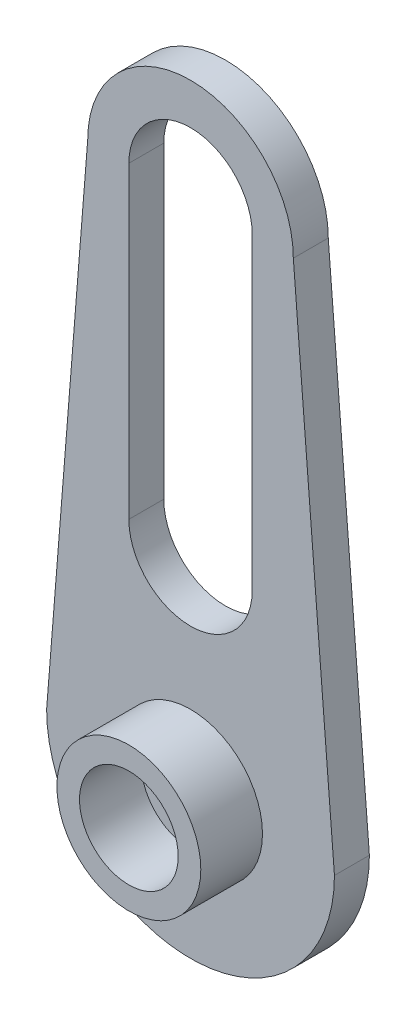
ISO-10303-21;
HEADER;
FILE_DESCRIPTION(('STEP AP214'),'2;1');
FILE_NAME('part.step','',(''),(''),'','','');
FILE_SCHEMA(('AUTOMOTIVE_DESIGN { 1 0 10303 214 1 1 1 1 }'));
ENDSEC;
DATA;
#1=APPLICATION_CONTEXT('core data for automotive mechanical design processes');
#2=APPLICATION_PROTOCOL_DEFINITION('international standard','automotive_design',2000,#1);
#3=PRODUCT_CONTEXT('',#1,'mechanical');
#4=PRODUCT('Part','Part','',(#3));
#5=PRODUCT_RELATED_PRODUCT_CATEGORY('part','',(#4));
#6=PRODUCT_DEFINITION_FORMATION('','',#4);
#7=PRODUCT_DEFINITION_CONTEXT('part definition',#1,'design');
#8=PRODUCT_DEFINITION('design','',#6,#7);
#9=PRODUCT_DEFINITION_SHAPE('','',#8);
#10=(LENGTH_UNIT() NAMED_UNIT(*) SI_UNIT(.MILLI.,.METRE.));
#11=(NAMED_UNIT(*) PLANE_ANGLE_UNIT() SI_UNIT($,.RADIAN.));
#12=(NAMED_UNIT(*) SI_UNIT($,.STERADIAN.) SOLID_ANGLE_UNIT());
#13=UNCERTAINTY_MEASURE_WITH_UNIT(LENGTH_MEASURE(1.E-05),#10,'distance_accuracy_value','');
#14=(GEOMETRIC_REPRESENTATION_CONTEXT(3) GLOBAL_UNCERTAINTY_ASSIGNED_CONTEXT((#13)) GLOBAL_UNIT_ASSIGNED_CONTEXT((#10,
#11,#12)) REPRESENTATION_CONTEXT('',''));
#15=CARTESIAN_POINT('',(0.,0.,0.));
#16=DIRECTION('',(0.,0.,1.));
#17=DIRECTION('',(1.,0.,0.));
#18=AXIS2_PLACEMENT_3D('',#15,#16,#17);
#19=CARTESIAN_POINT('',(0.,0.,1.7));
#20=DIRECTION('',(0.,0.,-1.));
#21=DIRECTION('',(-1.,0.,0.));
#22=AXIS2_PLACEMENT_3D('',#19,#20,#21);
#23=CYLINDRICAL_SURFACE('',#22,1.1);
#24=CARTESIAN_POINT('',(0.,0.,1.7));
#25=DIRECTION('',(0.,0.,1.));
#26=DIRECTION('',(1.,0.,0.));
#27=AXIS2_PLACEMENT_3D('',#24,#25,#26);
#28=CIRCLE('',#27,1.1);
#29=CARTESIAN_POINT('',(1.1,0.,1.7));
#30=VERTEX_POINT('',#29);
#31=EDGE_CURVE('E195',#30,#30,#28,.T.);
#32=ORIENTED_EDGE('',*,*,#31,.T.);
#33=EDGE_LOOP('',(#32));
#34=FACE_BOUND('',#33,.T.);
#35=CARTESIAN_POINT('',(0.,0.,1.));
#36=DIRECTION('',(0.,0.,-1.));
#37=DIRECTION('',(-1.,0.,0.));
#38=AXIS2_PLACEMENT_3D('',#35,#36,#37);
#39=CIRCLE('',#38,1.1);
#40=CARTESIAN_POINT('',(-1.1,0.,1.));
#41=VERTEX_POINT('',#40);
#42=EDGE_CURVE('E45',#41,#41,#39,.T.);
#43=ORIENTED_EDGE('',*,*,#42,.T.);
#44=EDGE_LOOP('',(#43));
#45=FACE_BOUND('',#44,.T.);
#46=ADVANCED_FACE('F41',(#34,#45),#23,.F.);
#47=CARTESIAN_POINT('',(0.,0.,1.7));
#48=DIRECTION('',(0.,0.,1.));
#49=DIRECTION('',(1.,0.,0.));
#50=AXIS2_PLACEMENT_3D('',#47,#48,#49);
#51=PLANE('',#50);
#52=ORIENTED_EDGE('',*,*,#31,.F.);
#53=EDGE_LOOP('',(#52));
#54=FACE_BOUND('',#53,.T.);
#55=CARTESIAN_POINT('',(0.,0.,1.7));
#56=DIRECTION('',(0.,0.,1.));
#57=DIRECTION('',(1.,0.,0.));
#58=AXIS2_PLACEMENT_3D('',#55,#56,#57);
#59=CIRCLE('',#58,2.4);
#60=CARTESIAN_POINT('',(2.4,0.,1.7));
#61=VERTEX_POINT('',#60);
#62=EDGE_CURVE('E11',#61,#61,#59,.F.);
#63=ORIENTED_EDGE('',*,*,#62,.F.);
#64=EDGE_LOOP('',(#63));
#65=FACE_BOUND('',#64,.T.);
#66=ADVANCED_FACE('F247',(#54,#65),#51,.T.);
#67=CARTESIAN_POINT('',(6.95548489666137,0.556438791732909,1.7));
#68=DIRECTION('',(0.996815278536125,0.07974522228289,0.));
#69=DIRECTION('',(-0.07974522228289,0.996815278536125,0.));
#70=AXIS2_PLACEMENT_3D('',#67,#68,#69);
#71=PLANE('',#70);
#72=DIRECTION('',(0.07974522228289,-0.996815278536125,0.));
#73=VECTOR('',#72,1.);
#74=CARTESIAN_POINT('',(6.95548489666137,0.556438791732909,0.));
#75=LINE('',#74,#73);
#76=CARTESIAN_POINT('',(5.,25.,0.));
#77=VERTEX_POINT('',#76);
#78=CARTESIAN_POINT('',(7.,0.,0.));
#79=VERTEX_POINT('',#78);
#80=EDGE_CURVE('E172',#77,#79,#75,.T.);
#81=ORIENTED_EDGE('',*,*,#80,.F.);
#82=DIRECTION('',(0.,0.,-1.));
#83=VECTOR('',#82,1.);
#84=CARTESIAN_POINT('',(5.,25.,1.7));
#85=LINE('',#84,#83);
#86=CARTESIAN_POINT('',(5.,25.,1.7));
#87=VERTEX_POINT('',#86);
#88=EDGE_CURVE('E52',#87,#77,#85,.T.);
#89=ORIENTED_EDGE('',*,*,#88,.F.);
#90=DIRECTION('',(0.07974522228289,-0.996815278536125,0.));
#91=VECTOR('',#90,1.);
#92=CARTESIAN_POINT('',(6.95548489666137,0.556438791732909,1.7));
#93=LINE('',#92,#91);
#94=CARTESIAN_POINT('',(7.,0.,1.7));
#95=VERTEX_POINT('',#94);
#96=EDGE_CURVE('E133',#87,#95,#93,.T.);
#97=ORIENTED_EDGE('',*,*,#96,.T.);
#98=DIRECTION('',(0.,0.,-1.));
#99=VECTOR('',#98,1.);
#100=CARTESIAN_POINT('',(7.,0.,1.7));
#101=LINE('',#100,#99);
#102=EDGE_CURVE('E95',#95,#79,#101,.T.);
#103=ORIENTED_EDGE('',*,*,#102,.T.);
#104=EDGE_LOOP('',(#81,#89,#97,#103));
#105=FACE_BOUND('',#104,.T.);
#106=ADVANCED_FACE('F253',(#105),#71,.T.);
#107=CARTESIAN_POINT('',(0.,25.,1.7));
#108=DIRECTION('',(0.,0.,-1.));
#109=DIRECTION('',(-1.,0.,0.));
#110=AXIS2_PLACEMENT_3D('',#107,#108,#109);
#111=CYLINDRICAL_SURFACE('',#110,5.);
#112=CARTESIAN_POINT('',(0.,25.,0.));
#113=DIRECTION('',(0.,0.,1.));
#114=DIRECTION('',(1.,0.,0.));
#115=AXIS2_PLACEMENT_3D('',#112,#113,#114);
#116=CIRCLE('',#115,5.);
#117=CARTESIAN_POINT('',(-5.,25.,0.));
#118=VERTEX_POINT('',#117);
#119=EDGE_CURVE('E139',#77,#118,#116,.T.);
#120=ORIENTED_EDGE('',*,*,#119,.T.);
#121=DIRECTION('',(0.,0.,-1.));
#122=VECTOR('',#121,1.);
#123=CARTESIAN_POINT('',(-5.,25.,1.7));
#124=LINE('',#123,#122);
#125=CARTESIAN_POINT('',(-5.,25.,1.7));
#126=VERTEX_POINT('',#125);
#127=EDGE_CURVE('E125',#126,#118,#124,.T.);
#128=ORIENTED_EDGE('',*,*,#127,.F.);
#129=CARTESIAN_POINT('',(0.,25.,1.7));
#130=DIRECTION('',(0.,0.,1.));
#131=DIRECTION('',(1.,0.,0.));
#132=AXIS2_PLACEMENT_3D('',#129,#130,#131);
#133=CIRCLE('',#132,5.);
#134=EDGE_CURVE('E129',#87,#126,#133,.T.);
#135=ORIENTED_EDGE('',*,*,#134,.F.);
#136=ORIENTED_EDGE('',*,*,#88,.T.);
#137=EDGE_LOOP('',(#120,#128,#135,#136));
#138=FACE_BOUND('',#137,.T.);
#139=ADVANCED_FACE('F137',(#138),#111,.T.);
#140=CARTESIAN_POINT('',(-6.95548489666137,0.556438791732909,1.7));
#141=DIRECTION('',(0.996815278536125,-0.07974522228289,0.));
#142=DIRECTION('',(0.07974522228289,0.996815278536125,0.));
#143=AXIS2_PLACEMENT_3D('',#140,#141,#142);
#144=PLANE('',#143);
#145=DIRECTION('',(-0.07974522228289,-0.996815278536125,0.));
#146=VECTOR('',#145,1.);
#147=CARTESIAN_POINT('',(-6.95548489666137,0.556438791732909,0.));
#148=LINE('',#147,#146);
#149=CARTESIAN_POINT('',(-7.,0.,0.));
#150=VERTEX_POINT('',#149);
#151=EDGE_CURVE('E167',#118,#150,#148,.T.);
#152=ORIENTED_EDGE('',*,*,#151,.T.);
#153=DIRECTION('',(0.,0.,-1.));
#154=VECTOR('',#153,1.);
#155=CARTESIAN_POINT('',(-7.,0.,1.7));
#156=LINE('',#155,#154);
#157=CARTESIAN_POINT('',(-7.,0.,1.7));
#158=VERTEX_POINT('',#157);
#159=EDGE_CURVE('E127',#158,#150,#156,.T.);
#160=ORIENTED_EDGE('',*,*,#159,.F.);
#161=DIRECTION('',(-0.07974522228289,-0.996815278536125,0.));
#162=VECTOR('',#161,1.);
#163=CARTESIAN_POINT('',(-6.95548489666137,0.556438791732909,1.7));
#164=LINE('',#163,#162);
#165=EDGE_CURVE('E120',#126,#158,#164,.T.);
#166=ORIENTED_EDGE('',*,*,#165,.F.);
#167=ORIENTED_EDGE('',*,*,#127,.T.);
#168=EDGE_LOOP('',(#152,#160,#166,#167));
#169=FACE_BOUND('',#168,.T.);
#170=ADVANCED_FACE('F123',(#169),#144,.F.);
#171=CARTESIAN_POINT('',(3.,0.,1.7));
#172=DIRECTION('',(1.,0.,0.));
#173=DIRECTION('',(0.,0.,-1.));
#174=AXIS2_PLACEMENT_3D('',#171,#172,#173);
#175=PLANE('',#174);
#176=DIRECTION('',(0.,-1.,0.));
#177=VECTOR('',#176,1.);
#178=CARTESIAN_POINT('',(3.,0.,0.));
#179=LINE('',#178,#177);
#180=CARTESIAN_POINT('',(3.,25.,0.));
#181=VERTEX_POINT('',#180);
#182=CARTESIAN_POINT('',(3.,10.,0.));
#183=VERTEX_POINT('',#182);
#184=EDGE_CURVE('E187',#181,#183,#179,.T.);
#185=ORIENTED_EDGE('',*,*,#184,.T.);
#186=DIRECTION('',(0.,0.,-1.));
#187=VECTOR('',#186,1.);
#188=CARTESIAN_POINT('',(3.,10.,1.7));
#189=LINE('',#188,#187);
#190=CARTESIAN_POINT('',(3.,10.,1.7));
#191=VERTEX_POINT('',#190);
#192=EDGE_CURVE('E157',#191,#183,#189,.T.);
#193=ORIENTED_EDGE('',*,*,#192,.F.);
#194=DIRECTION('',(0.,-1.,0.));
#195=VECTOR('',#194,1.);
#196=CARTESIAN_POINT('',(3.,0.,1.7));
#197=LINE('',#196,#195);
#198=CARTESIAN_POINT('',(3.,25.,1.7));
#199=VERTEX_POINT('',#198);
#200=EDGE_CURVE('E103',#199,#191,#197,.T.);
#201=ORIENTED_EDGE('',*,*,#200,.F.);
#202=DIRECTION('',(0.,0.,-1.));
#203=VECTOR('',#202,1.);
#204=CARTESIAN_POINT('',(3.,25.,1.7));
#205=LINE('',#204,#203);
#206=EDGE_CURVE('E148',#199,#181,#205,.T.);
#207=ORIENTED_EDGE('',*,*,#206,.T.);
#208=EDGE_LOOP('',(#185,#193,#201,#207));
#209=FACE_BOUND('',#208,.T.);
#210=ADVANCED_FACE('F43',(#209),#175,.F.);
#211=CARTESIAN_POINT('',(0.,10.,1.7));
#212=DIRECTION('',(0.,0.,-1.));
#213=DIRECTION('',(-1.,0.,0.));
#214=AXIS2_PLACEMENT_3D('',#211,#212,#213);
#215=CYLINDRICAL_SURFACE('',#214,3.);
#216=CARTESIAN_POINT('',(0.,10.,0.));
#217=DIRECTION('',(0.,0.,1.));
#218=DIRECTION('',(1.,0.,0.));
#219=AXIS2_PLACEMENT_3D('',#216,#217,#218);
#220=CIRCLE('',#219,3.);
#221=CARTESIAN_POINT('',(-3.,10.,0.));
#222=VERTEX_POINT('',#221);
#223=EDGE_CURVE('E183',#222,#183,#220,.T.);
#224=ORIENTED_EDGE('',*,*,#223,.F.);
#225=DIRECTION('',(0.,0.,-1.));
#226=VECTOR('',#225,1.);
#227=CARTESIAN_POINT('',(-3.,10.,1.7));
#228=LINE('',#227,#226);
#229=CARTESIAN_POINT('',(-3.,10.,1.7));
#230=VERTEX_POINT('',#229);
#231=EDGE_CURVE('E154',#230,#222,#228,.T.);
#232=ORIENTED_EDGE('',*,*,#231,.F.);
#233=CARTESIAN_POINT('',(0.,10.,1.7));
#234=DIRECTION('',(0.,0.,1.));
#235=DIRECTION('',(1.,0.,0.));
#236=AXIS2_PLACEMENT_3D('',#233,#234,#235);
#237=CIRCLE('',#236,3.);
#238=EDGE_CURVE('E206',#230,#191,#237,.T.);
#239=ORIENTED_EDGE('',*,*,#238,.T.);
#240=ORIENTED_EDGE('',*,*,#192,.T.);
#241=EDGE_LOOP('',(#224,#232,#239,#240));
#242=FACE_BOUND('',#241,.T.);
#243=ADVANCED_FACE('F266',(#242),#215,.F.);
#244=CARTESIAN_POINT('',(-3.,0.,1.7));
#245=DIRECTION('',(-1.,0.,0.));
#246=DIRECTION('',(0.,0.,1.));
#247=AXIS2_PLACEMENT_3D('',#244,#245,#246);
#248=PLANE('',#247);
#249=DIRECTION('',(0.,1.,0.));
#250=VECTOR('',#249,1.);
#251=CARTESIAN_POINT('',(-3.,0.,0.));
#252=LINE('',#251,#250);
#253=CARTESIAN_POINT('',(-3.,25.,0.));
#254=VERTEX_POINT('',#253);
#255=EDGE_CURVE('E179',#222,#254,#252,.T.);
#256=ORIENTED_EDGE('',*,*,#255,.T.);
#257=DIRECTION('',(0.,0.,-1.));
#258=VECTOR('',#257,1.);
#259=CARTESIAN_POINT('',(-3.,25.,1.7));
#260=LINE('',#259,#258);
#261=CARTESIAN_POINT('',(-3.,25.,1.7));
#262=VERTEX_POINT('',#261);
#263=EDGE_CURVE('E151',#262,#254,#260,.T.);
#264=ORIENTED_EDGE('',*,*,#263,.F.);
#265=DIRECTION('',(0.,1.,0.));
#266=VECTOR('',#265,1.);
#267=CARTESIAN_POINT('',(-3.,0.,1.7));
#268=LINE('',#267,#266);
#269=EDGE_CURVE('E203',#230,#262,#268,.T.);
#270=ORIENTED_EDGE('',*,*,#269,.F.);
#271=ORIENTED_EDGE('',*,*,#231,.T.);
#272=EDGE_LOOP('',(#256,#264,#270,#271));
#273=FACE_BOUND('',#272,.T.);
#274=ADVANCED_FACE('F263',(#273),#248,.F.);
#275=CARTESIAN_POINT('',(0.,25.,1.7));
#276=DIRECTION('',(0.,0.,-1.));
#277=DIRECTION('',(-1.,0.,0.));
#278=AXIS2_PLACEMENT_3D('',#275,#276,#277);
#279=CYLINDRICAL_SURFACE('',#278,3.);
#280=CARTESIAN_POINT('',(0.,25.,0.));
#281=DIRECTION('',(0.,0.,1.));
#282=DIRECTION('',(1.,0.,0.));
#283=AXIS2_PLACEMENT_3D('',#280,#281,#282);
#284=CIRCLE('',#283,3.);
#285=EDGE_CURVE('E175',#181,#254,#284,.T.);
#286=ORIENTED_EDGE('',*,*,#285,.F.);
#287=ORIENTED_EDGE('',*,*,#206,.F.);
#288=CARTESIAN_POINT('',(0.,25.,1.7));
#289=DIRECTION('',(0.,0.,1.));
#290=DIRECTION('',(1.,0.,0.));
#291=AXIS2_PLACEMENT_3D('',#288,#289,#290);
#292=CIRCLE('',#291,3.);
#293=EDGE_CURVE('E199',#199,#262,#292,.T.);
#294=ORIENTED_EDGE('',*,*,#293,.T.);
#295=ORIENTED_EDGE('',*,*,#263,.T.);
#296=EDGE_LOOP('',(#286,#287,#294,#295));
#297=FACE_BOUND('',#296,.T.);
#298=ADVANCED_FACE('F259',(#297),#279,.F.);
#299=CARTESIAN_POINT('',(0.,0.,1.7));
#300=DIRECTION('',(0.,0.,-1.));
#301=DIRECTION('',(-1.,0.,0.));
#302=AXIS2_PLACEMENT_3D('',#299,#300,#301);
#303=CYLINDRICAL_SURFACE('',#302,7.);
#304=CARTESIAN_POINT('',(0.,0.,0.));
#305=DIRECTION('',(0.,0.,1.));
#306=DIRECTION('',(1.,0.,0.));
#307=AXIS2_PLACEMENT_3D('',#304,#305,#306);
#308=CIRCLE('',#307,7.);
#309=EDGE_CURVE('E88',#150,#79,#308,.T.);
#310=ORIENTED_EDGE('',*,*,#309,.T.);
#311=ORIENTED_EDGE('',*,*,#102,.F.);
#312=CARTESIAN_POINT('',(0.,0.,1.7));
#313=DIRECTION('',(0.,0.,1.));
#314=DIRECTION('',(1.,0.,0.));
#315=AXIS2_PLACEMENT_3D('',#312,#313,#314);
#316=CIRCLE('',#315,7.);
#317=EDGE_CURVE('E60',#158,#95,#316,.T.);
#318=ORIENTED_EDGE('',*,*,#317,.F.);
#319=ORIENTED_EDGE('',*,*,#159,.T.);
#320=EDGE_LOOP('',(#310,#311,#318,#319));
#321=FACE_BOUND('',#320,.T.);
#322=ADVANCED_FACE('F262',(#321),#303,.T.);
#323=CARTESIAN_POINT('',(0.,0.,1.7));
#324=DIRECTION('',(0.,0.,1.));
#325=DIRECTION('',(1.,0.,0.));
#326=AXIS2_PLACEMENT_3D('',#323,#324,#325);
#327=CIRCLE('',#326,3.5);
#328=CARTESIAN_POINT('',(3.5,0.,1.7));
#329=VERTEX_POINT('',#328);
#330=EDGE_CURVE('E211',#329,#329,#327,.T.);
#331=ORIENTED_EDGE('',*,*,#330,.F.);
#332=EDGE_LOOP('',(#331));
#333=FACE_BOUND('',#332,.T.);
#334=ORIENTED_EDGE('',*,*,#200,.T.);
#335=ORIENTED_EDGE('',*,*,#238,.F.);
#336=ORIENTED_EDGE('',*,*,#269,.T.);
#337=ORIENTED_EDGE('',*,*,#293,.F.);
#338=EDGE_LOOP('',(#334,#335,#336,#337));
#339=FACE_BOUND('',#338,.T.);
#340=ORIENTED_EDGE('',*,*,#96,.F.);
#341=ORIENTED_EDGE('',*,*,#134,.T.);
#342=ORIENTED_EDGE('',*,*,#165,.T.);
#343=ORIENTED_EDGE('',*,*,#317,.T.);
#344=EDGE_LOOP('',(#340,#341,#342,#343));
#345=FACE_BOUND('',#344,.T.);
#346=ADVANCED_FACE('F132',(#333,#339,#345),#51,.T.);
#347=CARTESIAN_POINT('',(0.,0.,0.));
#348=DIRECTION('',(0.,0.,1.));
#349=DIRECTION('',(1.,0.,0.));
#350=AXIS2_PLACEMENT_3D('',#347,#348,#349);
#351=PLANE('',#350);
#352=CARTESIAN_POINT('',(0.,0.,0.));
#353=DIRECTION('',(0.,0.,-1.));
#354=DIRECTION('',(-1.,0.,0.));
#355=AXIS2_PLACEMENT_3D('',#352,#353,#354);
#356=CIRCLE('',#355,2.25);
#357=CARTESIAN_POINT('',(-2.25,0.,0.));
#358=VERTEX_POINT('',#357);
#359=EDGE_CURVE('E222',#358,#358,#356,.T.);
#360=ORIENTED_EDGE('',*,*,#359,.F.);
#361=EDGE_LOOP('',(#360));
#362=FACE_BOUND('',#361,.T.);
#363=ORIENTED_EDGE('',*,*,#184,.F.);
#364=ORIENTED_EDGE('',*,*,#285,.T.);
#365=ORIENTED_EDGE('',*,*,#255,.F.);
#366=ORIENTED_EDGE('',*,*,#223,.T.);
#367=EDGE_LOOP('',(#363,#364,#365,#366));
#368=FACE_BOUND('',#367,.T.);
#369=ORIENTED_EDGE('',*,*,#80,.T.);
#370=ORIENTED_EDGE('',*,*,#309,.F.);
#371=ORIENTED_EDGE('',*,*,#151,.F.);
#372=ORIENTED_EDGE('',*,*,#119,.F.);
#373=EDGE_LOOP('',(#369,#370,#371,#372));
#374=FACE_BOUND('',#373,.T.);
#375=ADVANCED_FACE('F277',(#362,#368,#374),#351,.F.);
#376=CARTESIAN_POINT('',(0.,0.,4.7));
#377=DIRECTION('',(0.,0.,1.));
#378=DIRECTION('',(1.,0.,0.));
#379=AXIS2_PLACEMENT_3D('',#376,#377,#378);
#380=PLANE('',#379);
#381=CARTESIAN_POINT('',(0.,0.,4.7));
#382=DIRECTION('',(0.,0.,1.));
#383=DIRECTION('',(1.,0.,0.));
#384=AXIS2_PLACEMENT_3D('',#381,#382,#383);
#385=CIRCLE('',#384,3.5);
#386=CARTESIAN_POINT('',(3.5,0.,4.7));
#387=VERTEX_POINT('',#386);
#388=EDGE_CURVE('E190',#387,#387,#385,.T.);
#389=ORIENTED_EDGE('',*,*,#388,.T.);
#390=EDGE_LOOP('',(#389));
#391=FACE_BOUND('',#390,.T.);
#392=CARTESIAN_POINT('',(0.,0.,4.7));
#393=DIRECTION('',(0.,0.,1.));
#394=DIRECTION('',(1.,0.,0.));
#395=AXIS2_PLACEMENT_3D('',#392,#393,#394);
#396=CIRCLE('',#395,2.4);
#397=CARTESIAN_POINT('',(2.4,0.,4.7));
#398=VERTEX_POINT('',#397);
#399=EDGE_CURVE('E215',#398,#398,#396,.T.);
#400=ORIENTED_EDGE('',*,*,#399,.F.);
#401=EDGE_LOOP('',(#400));
#402=FACE_BOUND('',#401,.T.);
#403=ADVANCED_FACE('F286',(#391,#402),#380,.T.);
#404=CARTESIAN_POINT('',(0.,0.,4.7));
#405=DIRECTION('',(0.,0.,-1.));
#406=DIRECTION('',(-1.,0.,0.));
#407=AXIS2_PLACEMENT_3D('',#404,#405,#406);
#408=CYLINDRICAL_SURFACE('',#407,3.5);
#409=ORIENTED_EDGE('',*,*,#388,.F.);
#410=EDGE_LOOP('',(#409));
#411=FACE_BOUND('',#410,.T.);
#412=ORIENTED_EDGE('',*,*,#330,.T.);
#413=EDGE_LOOP('',(#412));
#414=FACE_BOUND('',#413,.T.);
#415=ADVANCED_FACE('F293',(#411,#414),#408,.T.);
#416=CARTESIAN_POINT('',(0.,0.,4.7));
#417=DIRECTION('',(0.,0.,-1.));
#418=DIRECTION('',(-1.,0.,0.));
#419=AXIS2_PLACEMENT_3D('',#416,#417,#418);
#420=CYLINDRICAL_SURFACE('',#419,2.4);
#421=ORIENTED_EDGE('',*,*,#399,.T.);
#422=EDGE_LOOP('',(#421));
#423=FACE_BOUND('',#422,.T.);
#424=ORIENTED_EDGE('',*,*,#62,.T.);
#425=EDGE_LOOP('',(#424));
#426=FACE_BOUND('',#425,.T.);
#427=ADVANCED_FACE('F243',(#423,#426),#420,.F.);
#428=CARTESIAN_POINT('',(0.,0.,1.));
#429=DIRECTION('',(0.,0.,-1.));
#430=DIRECTION('',(-1.,0.,0.));
#431=AXIS2_PLACEMENT_3D('',#428,#429,#430);
#432=CYLINDRICAL_SURFACE('',#431,2.25);
#433=CARTESIAN_POINT('',(0.,0.,1.));
#434=DIRECTION('',(0.,0.,-1.));
#435=DIRECTION('',(-1.,0.,0.));
#436=AXIS2_PLACEMENT_3D('',#433,#434,#435);
#437=CIRCLE('',#436,2.25);
#438=CARTESIAN_POINT('',(-2.25,0.,1.));
#439=VERTEX_POINT('',#438);
#440=EDGE_CURVE('E226',#439,#439,#437,.T.);
#441=ORIENTED_EDGE('',*,*,#440,.F.);
#442=EDGE_LOOP('',(#441));
#443=FACE_BOUND('',#442,.T.);
#444=ORIENTED_EDGE('',*,*,#359,.T.);
#445=EDGE_LOOP('',(#444));
#446=FACE_BOUND('',#445,.T.);
#447=ADVANCED_FACE('F238',(#443,#446),#432,.F.);
#448=CARTESIAN_POINT('',(0.,0.,1.));
#449=DIRECTION('',(0.,0.,-1.));
#450=DIRECTION('',(-1.,0.,0.));
#451=AXIS2_PLACEMENT_3D('',#448,#449,#450);
#452=PLANE('',#451);
#453=ORIENTED_EDGE('',*,*,#42,.F.);
#454=EDGE_LOOP('',(#453));
#455=FACE_BOUND('',#454,.T.);
#456=ORIENTED_EDGE('',*,*,#440,.T.);
#457=EDGE_LOOP('',(#456));
#458=FACE_BOUND('',#457,.T.);
#459=ADVANCED_FACE('F236',(#455,#458),#452,.T.);
#460=CLOSED_SHELL('',(#46,#66,#106,#139,#170,#210,#243,#274,#298,#322,#346,#375,#403,#415,#427,
#447,#459));
#461=MANIFOLD_SOLID_BREP('B2',#460);
#462=ADVANCED_BREP_SHAPE_REPRESENTATION('',(#18,#461),#14);
#463=SHAPE_DEFINITION_REPRESENTATION(#9,#462);
ENDSEC;
END-ISO-10303-21;
